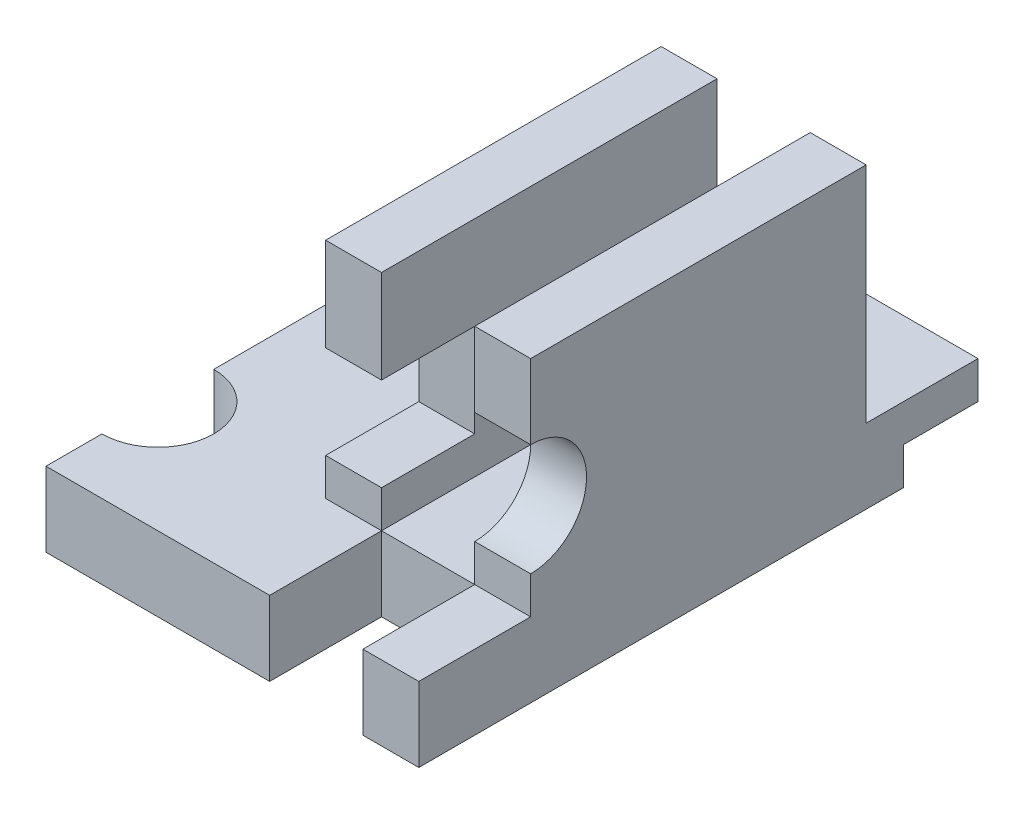
ISO-10303-21;
HEADER;
FILE_DESCRIPTION(('STEP AP214'),'2;1');
FILE_NAME('part.step','',(''),(''),'','','');
FILE_SCHEMA(('AUTOMOTIVE_DESIGN { 1 0 10303 214 1 1 1 1 }'));
ENDSEC;
DATA;
#1=APPLICATION_CONTEXT('core data for automotive mechanical design processes');
#2=APPLICATION_PROTOCOL_DEFINITION('international standard','automotive_design',2000,#1);
#3=PRODUCT_CONTEXT('',#1,'mechanical');
#4=PRODUCT('Part','Part','',(#3));
#5=PRODUCT_RELATED_PRODUCT_CATEGORY('part','',(#4));
#6=PRODUCT_DEFINITION_FORMATION('','',#4);
#7=PRODUCT_DEFINITION_CONTEXT('part definition',#1,'design');
#8=PRODUCT_DEFINITION('design','',#6,#7);
#9=PRODUCT_DEFINITION_SHAPE('','',#8);
#10=(LENGTH_UNIT() NAMED_UNIT(*) SI_UNIT(.MILLI.,.METRE.));
#11=(NAMED_UNIT(*) PLANE_ANGLE_UNIT() SI_UNIT($,.RADIAN.));
#12=(NAMED_UNIT(*) SI_UNIT($,.STERADIAN.) SOLID_ANGLE_UNIT());
#13=UNCERTAINTY_MEASURE_WITH_UNIT(LENGTH_MEASURE(1.E-05),#10,'distance_accuracy_value','');
#14=(GEOMETRIC_REPRESENTATION_CONTEXT(3) GLOBAL_UNCERTAINTY_ASSIGNED_CONTEXT((#13)) GLOBAL_UNIT_ASSIGNED_CONTEXT((#10,
#11,#12)) REPRESENTATION_CONTEXT('',''));
#15=CARTESIAN_POINT('',(0.,0.,0.));
#16=DIRECTION('',(0.,0.,1.));
#17=DIRECTION('',(1.,0.,0.));
#18=AXIS2_PLACEMENT_3D('',#15,#16,#17);
#19=CARTESIAN_POINT('',(10.,60.,45.));
#20=DIRECTION('',(0.,0.,-1.));
#21=DIRECTION('',(-1.,0.,0.));
#22=AXIS2_PLACEMENT_3D('',#19,#20,#21);
#23=PLANE('',#22);
#24=DIRECTION('',(-1.,0.,0.));
#25=VECTOR('',#24,1.);
#26=CARTESIAN_POINT('',(50.001,10.,45.));
#27=LINE('',#26,#25);
#28=CARTESIAN_POINT('',(10.,10.,45.));
#29=VERTEX_POINT('',#28);
#30=CARTESIAN_POINT('',(-4.99999999999998,10.,45.));
#31=VERTEX_POINT('',#30);
#32=EDGE_CURVE('E238',#29,#31,#27,.T.);
#33=ORIENTED_EDGE('',*,*,#32,.T.);
#34=DIRECTION('',(0.,-1.,0.));
#35=VECTOR('',#34,1.);
#36=CARTESIAN_POINT('',(-4.99999999999998,60.,45.));
#37=LINE('',#36,#35);
#38=CARTESIAN_POINT('',(-4.99999999999998,0.,45.));
#39=VERTEX_POINT('',#38);
#40=EDGE_CURVE('E308',#31,#39,#37,.T.);
#41=ORIENTED_EDGE('',*,*,#40,.T.);
#42=DIRECTION('',(1.,0.,0.));
#43=VECTOR('',#42,1.);
#44=CARTESIAN_POINT('',(10.,0.,45.));
#45=LINE('',#44,#43);
#46=CARTESIAN_POINT('',(10.,0.,45.));
#47=VERTEX_POINT('',#46);
#48=EDGE_CURVE('E297',#39,#47,#45,.T.);
#49=ORIENTED_EDGE('',*,*,#48,.T.);
#50=DIRECTION('',(0.,-1.,0.));
#51=VECTOR('',#50,1.);
#52=CARTESIAN_POINT('',(10.,60.,45.));
#53=LINE('',#52,#51);
#54=EDGE_CURVE('E328',#29,#47,#53,.T.);
#55=ORIENTED_EDGE('',*,*,#54,.F.);
#56=EDGE_LOOP('',(#33,#41,#49,#55));
#57=FACE_BOUND('',#56,.T.);
#58=ADVANCED_FACE('F35',(#57),#23,.F.);
#59=DIRECTION('',(-1.,0.,0.));
#60=VECTOR('',#59,1.);
#61=CARTESIAN_POINT('',(50.001,35.,45.));
#62=LINE('',#61,#60);
#63=CARTESIAN_POINT('',(10.,35.,45.));
#64=VERTEX_POINT('',#63);
#65=CARTESIAN_POINT('',(-4.99999999999998,35.,45.));
#66=VERTEX_POINT('',#65);
#67=EDGE_CURVE('E60',#64,#66,#62,.T.);
#68=ORIENTED_EDGE('',*,*,#67,.F.);
#69=CARTESIAN_POINT('',(10.,60.,45.));
#70=VERTEX_POINT('',#69);
#71=EDGE_CURVE('E329',#70,#64,#53,.T.);
#72=ORIENTED_EDGE('',*,*,#71,.F.);
#73=DIRECTION('',(1.,0.,0.));
#74=VECTOR('',#73,1.);
#75=CARTESIAN_POINT('',(10.,60.,45.));
#76=LINE('',#75,#74);
#77=CARTESIAN_POINT('',(-4.99999999999998,60.,45.));
#78=VERTEX_POINT('',#77);
#79=EDGE_CURVE('E298',#78,#70,#76,.T.);
#80=ORIENTED_EDGE('',*,*,#79,.F.);
#81=EDGE_CURVE('E319',#78,#66,#37,.T.);
#82=ORIENTED_EDGE('',*,*,#81,.T.);
#83=EDGE_LOOP('',(#68,#72,#80,#82));
#84=FACE_BOUND('',#83,.T.);
#85=ADVANCED_FACE('F416',(#84),#23,.F.);
#86=CARTESIAN_POINT('',(10.,60.,45.));
#87=DIRECTION('',(-1.,0.,0.));
#88=DIRECTION('',(0.,0.,1.));
#89=AXIS2_PLACEMENT_3D('',#86,#87,#88);
#90=PLANE('',#89);
#91=DIRECTION('',(0.,0.,1.));
#92=VECTOR('',#91,1.);
#93=CARTESIAN_POINT('',(10.,10.,45.));
#94=LINE('',#93,#92);
#95=CARTESIAN_POINT('',(10.,10.,20.));
#96=VERTEX_POINT('',#95);
#97=EDGE_CURVE('E237',#96,#29,#94,.T.);
#98=ORIENTED_EDGE('',*,*,#97,.T.);
#99=ORIENTED_EDGE('',*,*,#54,.T.);
#100=DIRECTION('',(0.,0.,-1.));
#101=VECTOR('',#100,1.);
#102=CARTESIAN_POINT('',(10.,0.,45.));
#103=LINE('',#102,#101);
#104=CARTESIAN_POINT('',(10.,0.,-45.));
#105=VERTEX_POINT('',#104);
#106=EDGE_CURVE('E311',#47,#105,#103,.T.);
#107=ORIENTED_EDGE('',*,*,#106,.T.);
#108=DIRECTION('',(0.,-1.,0.));
#109=VECTOR('',#108,1.);
#110=CARTESIAN_POINT('',(10.,60.,-45.));
#111=LINE('',#110,#109);
#112=CARTESIAN_POINT('',(10.,60.,-45.));
#113=VERTEX_POINT('',#112);
#114=EDGE_CURVE('E325',#113,#105,#111,.T.);
#115=ORIENTED_EDGE('',*,*,#114,.F.);
#116=DIRECTION('',(0.,0.,-1.));
#117=VECTOR('',#116,1.);
#118=CARTESIAN_POINT('',(10.,60.,45.));
#119=LINE('',#118,#117);
#120=EDGE_CURVE('E301',#70,#113,#119,.T.);
#121=ORIENTED_EDGE('',*,*,#120,.F.);
#122=ORIENTED_EDGE('',*,*,#71,.T.);
#123=DIRECTION('',(0.,0.,-1.));
#124=VECTOR('',#123,1.);
#125=CARTESIAN_POINT('',(10.,35.,20.));
#126=LINE('',#125,#124);
#127=CARTESIAN_POINT('',(10.,35.,20.));
#128=VERTEX_POINT('',#127);
#129=EDGE_CURVE('E231',#64,#128,#126,.T.);
#130=ORIENTED_EDGE('',*,*,#129,.T.);
#131=DIRECTION('',(0.,-1.,0.));
#132=VECTOR('',#131,1.);
#133=CARTESIAN_POINT('',(10.,10.,20.));
#134=LINE('',#133,#132);
#135=EDGE_CURVE('E244',#128,#96,#134,.T.);
#136=ORIENTED_EDGE('',*,*,#135,.T.);
#137=EDGE_LOOP('',(#98,#99,#107,#115,#121,#122,#130,#136));
#138=FACE_BOUND('',#137,.T.);
#139=ADVANCED_FACE('F422',(#138),#90,.F.);
#140=CARTESIAN_POINT('',(-4.99999999999998,60.,45.));
#141=DIRECTION('',(1.,0.,0.));
#142=DIRECTION('',(0.,0.,-1.));
#143=AXIS2_PLACEMENT_3D('',#140,#141,#142);
#144=PLANE('',#143);
#145=DIRECTION('',(0.,0.,-1.));
#146=VECTOR('',#145,1.);
#147=CARTESIAN_POINT('',(-4.99999999999998,10.,45.));
#148=LINE('',#147,#146);
#149=CARTESIAN_POINT('',(-4.99999999999998,10.,20.));
#150=VERTEX_POINT('',#149);
#151=EDGE_CURVE('E241',#31,#150,#148,.T.);
#152=ORIENTED_EDGE('',*,*,#151,.T.);
#153=DIRECTION('',(0.,1.,0.));
#154=VECTOR('',#153,1.);
#155=CARTESIAN_POINT('',(-4.99999999999998,10.,20.));
#156=LINE('',#155,#154);
#157=CARTESIAN_POINT('',(-4.99999999999998,35.,20.));
#158=VERTEX_POINT('',#157);
#159=EDGE_CURVE('E235',#150,#158,#156,.T.);
#160=ORIENTED_EDGE('',*,*,#159,.T.);
#161=DIRECTION('',(0.,0.,1.));
#162=VECTOR('',#161,1.);
#163=CARTESIAN_POINT('',(-4.99999999999998,35.,20.));
#164=LINE('',#163,#162);
#165=EDGE_CURVE('E248',#158,#66,#164,.T.);
#166=ORIENTED_EDGE('',*,*,#165,.T.);
#167=ORIENTED_EDGE('',*,*,#81,.F.);
#168=DIRECTION('',(0.,0.,1.));
#169=VECTOR('',#168,1.);
#170=CARTESIAN_POINT('',(-4.99999999999998,60.,45.));
#171=LINE('',#170,#169);
#172=CARTESIAN_POINT('',(-4.99999999999998,60.,-45.));
#173=VERTEX_POINT('',#172);
#174=EDGE_CURVE('E306',#173,#78,#171,.T.);
#175=ORIENTED_EDGE('',*,*,#174,.F.);
#176=DIRECTION('',(0.,-1.,0.));
#177=VECTOR('',#176,1.);
#178=CARTESIAN_POINT('',(-4.99999999999998,60.,-45.));
#179=LINE('',#178,#177);
#180=CARTESIAN_POINT('',(-4.99999999999998,0.,-45.));
#181=VERTEX_POINT('',#180);
#182=EDGE_CURVE('E322',#173,#181,#179,.T.);
#183=ORIENTED_EDGE('',*,*,#182,.T.);
#184=DIRECTION('',(0.,0.,1.));
#185=VECTOR('',#184,1.);
#186=CARTESIAN_POINT('',(-4.99999999999998,0.,45.));
#187=LINE('',#186,#185);
#188=EDGE_CURVE('E302',#181,#39,#187,.T.);
#189=ORIENTED_EDGE('',*,*,#188,.T.);
#190=ORIENTED_EDGE('',*,*,#40,.F.);
#191=EDGE_LOOP('',(#152,#160,#166,#167,#175,#183,#189,#190));
#192=FACE_BOUND('',#191,.T.);
#193=ADVANCED_FACE('F501',(#192),#144,.F.);
#194=CARTESIAN_POINT('',(35.,60.,45.));
#195=DIRECTION('',(0.,0.,-1.));
#196=DIRECTION('',(-1.,0.,0.));
#197=AXIS2_PLACEMENT_3D('',#194,#195,#196);
#198=PLANE('',#197);
#199=DIRECTION('',(0.,-1.,0.));
#200=VECTOR('',#199,1.);
#201=CARTESIAN_POINT('',(35.,60.,45.));
#202=LINE('',#201,#200);
#203=CARTESIAN_POINT('',(35.,60.,45.));
#204=VERTEX_POINT('',#203);
#205=CARTESIAN_POINT('',(35.,40.,45.));
#206=VERTEX_POINT('',#205);
#207=EDGE_CURVE('E291',#204,#206,#202,.T.);
#208=ORIENTED_EDGE('',*,*,#207,.T.);
#209=DIRECTION('',(1.,0.,0.));
#210=VECTOR('',#209,1.);
#211=CARTESIAN_POINT('',(-50.001,40.,45.));
#212=LINE('',#211,#210);
#213=CARTESIAN_POINT('',(50.,40.,45.));
#214=VERTEX_POINT('',#213);
#215=EDGE_CURVE('E262',#206,#214,#212,.T.);
#216=ORIENTED_EDGE('',*,*,#215,.T.);
#217=DIRECTION('',(0.,-1.,0.));
#218=VECTOR('',#217,1.);
#219=CARTESIAN_POINT('',(50.,60.,45.));
#220=LINE('',#219,#218);
#221=CARTESIAN_POINT('',(50.,60.,45.));
#222=VERTEX_POINT('',#221);
#223=EDGE_CURVE('E287',#222,#214,#220,.T.);
#224=ORIENTED_EDGE('',*,*,#223,.F.);
#225=DIRECTION('',(1.,0.,0.));
#226=VECTOR('',#225,1.);
#227=CARTESIAN_POINT('',(35.,60.,45.));
#228=LINE('',#227,#226);
#229=EDGE_CURVE('E272',#204,#222,#228,.T.);
#230=ORIENTED_EDGE('',*,*,#229,.F.);
#231=EDGE_LOOP('',(#208,#216,#224,#230));
#232=FACE_BOUND('',#231,.T.);
#233=ADVANCED_FACE('F447',(#232),#198,.F.);
#234=CARTESIAN_POINT('',(0.,0.,0.));
#235=DIRECTION('',(0.,-1.,0.));
#236=DIRECTION('',(0.,0.,-1.));
#237=AXIS2_PLACEMENT_3D('',#234,#235,#236);
#238=PLANE('',#237);
#239=DIRECTION('',(-1.,0.,0.));
#240=VECTOR('',#239,1.);
#241=CARTESIAN_POINT('',(50.,0.,-45.));
#242=LINE('',#241,#240);
#243=CARTESIAN_POINT('',(50.,0.,-45.));
#244=VERTEX_POINT('',#243);
#245=CARTESIAN_POINT('',(35.,0.,-45.));
#246=VERTEX_POINT('',#245);
#247=EDGE_CURVE('E265',#244,#246,#242,.T.);
#248=ORIENTED_EDGE('',*,*,#247,.F.);
#249=DIRECTION('',(0.,0.,-1.));
#250=VECTOR('',#249,1.);
#251=CARTESIAN_POINT('',(50.,0.,75.));
#252=LINE('',#251,#250);
#253=CARTESIAN_POINT('',(50.,0.,-75.));
#254=VERTEX_POINT('',#253);
#255=EDGE_CURVE('E368',#244,#254,#252,.T.);
#256=ORIENTED_EDGE('',*,*,#255,.T.);
#257=DIRECTION('',(-1.,0.,0.));
#258=VECTOR('',#257,1.);
#259=CARTESIAN_POINT('',(-50.,0.,-75.));
#260=LINE('',#259,#258);
#261=CARTESIAN_POINT('',(-50.,0.,-75.));
#262=VERTEX_POINT('',#261);
#263=EDGE_CURVE('E383',#254,#262,#260,.T.);
#264=ORIENTED_EDGE('',*,*,#263,.T.);
#265=DIRECTION('',(0.,0.,1.));
#266=VECTOR('',#265,1.);
#267=CARTESIAN_POINT('',(-50.,0.,75.));
#268=LINE('',#267,#266);
#269=CARTESIAN_POINT('',(-50.,0.,30.));
#270=VERTEX_POINT('',#269);
#271=EDGE_CURVE('E387',#262,#270,#268,.T.);
#272=ORIENTED_EDGE('',*,*,#271,.T.);
#273=CARTESIAN_POINT('',(-50.,0.,45.));
#274=DIRECTION('',(0.,1.,0.));
#275=DIRECTION('',(0.,0.,1.));
#276=AXIS2_PLACEMENT_3D('',#273,#274,#275);
#277=CIRCLE('',#276,15.);
#278=CARTESIAN_POINT('',(-50.,0.,60.));
#279=VERTEX_POINT('',#278);
#280=EDGE_CURVE('E358',#279,#270,#277,.T.);
#281=ORIENTED_EDGE('',*,*,#280,.F.);
#282=CARTESIAN_POINT('',(-50.,0.,75.));
#283=VERTEX_POINT('',#282);
#284=EDGE_CURVE('E386',#279,#283,#268,.T.);
#285=ORIENTED_EDGE('',*,*,#284,.T.);
#286=DIRECTION('',(1.,0.,0.));
#287=VECTOR('',#286,1.);
#288=CARTESIAN_POINT('',(-50.,0.,75.));
#289=LINE('',#288,#287);
#290=CARTESIAN_POINT('',(10.,0.,75.));
#291=VERTEX_POINT('',#290);
#292=EDGE_CURVE('E373',#283,#291,#289,.T.);
#293=ORIENTED_EDGE('',*,*,#292,.T.);
#294=DIRECTION('',(0.,0.,-1.));
#295=VECTOR('',#294,1.);
#296=CARTESIAN_POINT('',(10.,0.,75.));
#297=LINE('',#296,#295);
#298=EDGE_CURVE('E336',#291,#47,#297,.T.);
#299=ORIENTED_EDGE('',*,*,#298,.T.);
#300=ORIENTED_EDGE('',*,*,#48,.F.);
#301=ORIENTED_EDGE('',*,*,#188,.F.);
#302=DIRECTION('',(-1.,0.,0.));
#303=VECTOR('',#302,1.);
#304=CARTESIAN_POINT('',(-4.99999999999998,0.,-45.));
#305=LINE('',#304,#303);
#306=EDGE_CURVE('E314',#105,#181,#305,.T.);
#307=ORIENTED_EDGE('',*,*,#306,.F.);
#308=ORIENTED_EDGE('',*,*,#106,.F.);
#309=DIRECTION('',(1.,0.,0.));
#310=VECTOR('',#309,1.);
#311=CARTESIAN_POINT('',(10.,0.,45.));
#312=LINE('',#311,#310);
#313=CARTESIAN_POINT('',(35.,0.,45.));
#314=VERTEX_POINT('',#313);
#315=EDGE_CURVE('E332',#47,#314,#312,.T.);
#316=ORIENTED_EDGE('',*,*,#315,.T.);
#317=DIRECTION('',(0.,0.,1.));
#318=VECTOR('',#317,1.);
#319=CARTESIAN_POINT('',(35.,0.,-45.));
#320=LINE('',#319,#318);
#321=EDGE_CURVE('E279',#246,#314,#320,.T.);
#322=ORIENTED_EDGE('',*,*,#321,.F.);
#323=EDGE_LOOP('',(#248,#256,#264,#272,#281,#285,#293,#299,#300,#301,#307,#308,#316,#322));
#324=FACE_BOUND('',#323,.T.);
#325=ADVANCED_FACE('F402',(#324),#238,.F.);
#326=DIRECTION('',(1.,0.,0.));
#327=VECTOR('',#326,1.);
#328=CARTESIAN_POINT('',(35.,0.,45.));
#329=LINE('',#328,#327);
#330=CARTESIAN_POINT('',(50.,0.,45.));
#331=VERTEX_POINT('',#330);
#332=EDGE_CURVE('E270',#314,#331,#329,.T.);
#333=ORIENTED_EDGE('',*,*,#332,.F.);
#334=DIRECTION('',(0.,0.,1.));
#335=VECTOR('',#334,1.);
#336=CARTESIAN_POINT('',(35.,0.,45.));
#337=LINE('',#336,#335);
#338=CARTESIAN_POINT('',(35.,0.,75.));
#339=VERTEX_POINT('',#338);
#340=EDGE_CURVE('E343',#314,#339,#337,.T.);
#341=ORIENTED_EDGE('',*,*,#340,.T.);
#342=CARTESIAN_POINT('',(50.,0.,75.));
#343=VERTEX_POINT('',#342);
#344=EDGE_CURVE('E390',#339,#343,#289,.T.);
#345=ORIENTED_EDGE('',*,*,#344,.T.);
#346=EDGE_CURVE('E380',#343,#331,#252,.T.);
#347=ORIENTED_EDGE('',*,*,#346,.T.);
#348=EDGE_LOOP('',(#333,#341,#345,#347));
#349=FACE_BOUND('',#348,.T.);
#350=ADVANCED_FACE('F446',(#349),#238,.F.);
#351=CARTESIAN_POINT('',(-50.,-20.,75.));
#352=DIRECTION('',(0.,0.,1.));
#353=DIRECTION('',(1.,0.,0.));
#354=AXIS2_PLACEMENT_3D('',#351,#352,#353);
#355=PLANE('',#354);
#356=ORIENTED_EDGE('',*,*,#344,.F.);
#357=DIRECTION('',(0.,1.,0.));
#358=VECTOR('',#357,1.);
#359=CARTESIAN_POINT('',(35.,-20.,75.));
#360=LINE('',#359,#358);
#361=CARTESIAN_POINT('',(35.,-20.,75.));
#362=VERTEX_POINT('',#361);
#363=EDGE_CURVE('E353',#362,#339,#360,.T.);
#364=ORIENTED_EDGE('',*,*,#363,.F.);
#365=DIRECTION('',(1.,0.,0.));
#366=VECTOR('',#365,1.);
#367=CARTESIAN_POINT('',(-50.,-20.,75.));
#368=LINE('',#367,#366);
#369=CARTESIAN_POINT('',(50.,-20.,75.));
#370=VERTEX_POINT('',#369);
#371=EDGE_CURVE('E376',#362,#370,#368,.T.);
#372=ORIENTED_EDGE('',*,*,#371,.T.);
#373=DIRECTION('',(0.,1.,0.));
#374=VECTOR('',#373,1.);
#375=CARTESIAN_POINT('',(50.,-20.,75.));
#376=LINE('',#375,#374);
#377=EDGE_CURVE('E11',#370,#343,#376,.T.);
#378=ORIENTED_EDGE('',*,*,#377,.T.);
#379=EDGE_LOOP('',(#356,#364,#372,#378));
#380=FACE_BOUND('',#379,.T.);
#381=ADVANCED_FACE('F448',(#380),#355,.T.);
#382=CARTESIAN_POINT('',(-50.,-20.,75.));
#383=VERTEX_POINT('',#382);
#384=CARTESIAN_POINT('',(10.,-20.,75.));
#385=VERTEX_POINT('',#384);
#386=EDGE_CURVE('E377',#383,#385,#368,.T.);
#387=ORIENTED_EDGE('',*,*,#386,.T.);
#388=DIRECTION('',(0.,1.,0.));
#389=VECTOR('',#388,1.);
#390=CARTESIAN_POINT('',(10.,-20.,75.));
#391=LINE('',#390,#389);
#392=EDGE_CURVE('E350',#385,#291,#391,.T.);
#393=ORIENTED_EDGE('',*,*,#392,.T.);
#394=ORIENTED_EDGE('',*,*,#292,.F.);
#395=DIRECTION('',(0.,1.,0.));
#396=VECTOR('',#395,1.);
#397=CARTESIAN_POINT('',(-50.,-20.,75.));
#398=LINE('',#397,#396);
#399=EDGE_CURVE('E44',#383,#283,#398,.T.);
#400=ORIENTED_EDGE('',*,*,#399,.F.);
#401=EDGE_LOOP('',(#387,#393,#394,#400));
#402=FACE_BOUND('',#401,.T.);
#403=ADVANCED_FACE('F442',(#402),#355,.T.);
#404=CARTESIAN_POINT('',(0.,-20.,0.));
#405=DIRECTION('',(0.,-1.,0.));
#406=DIRECTION('',(0.,0.,-1.));
#407=AXIS2_PLACEMENT_3D('',#404,#405,#406);
#408=PLANE('',#407);
#409=DIRECTION('',(1.,0.,0.));
#410=VECTOR('',#409,1.);
#411=CARTESIAN_POINT('',(-50.,-20.,-55.));
#412=LINE('',#411,#410);
#413=CARTESIAN_POINT('',(-50.,-20.,-55.));
#414=VERTEX_POINT('',#413);
#415=CARTESIAN_POINT('',(50.,-20.,-55.));
#416=VERTEX_POINT('',#415);
#417=EDGE_CURVE('E210',#414,#416,#412,.T.);
#418=ORIENTED_EDGE('',*,*,#417,.T.);
#419=DIRECTION('',(0.,0.,-1.));
#420=VECTOR('',#419,1.);
#421=CARTESIAN_POINT('',(50.,-20.,75.));
#422=LINE('',#421,#420);
#423=EDGE_CURVE('E369',#370,#416,#422,.T.);
#424=ORIENTED_EDGE('',*,*,#423,.F.);
#425=ORIENTED_EDGE('',*,*,#371,.F.);
#426=DIRECTION('',(0.,0.,1.));
#427=VECTOR('',#426,1.);
#428=CARTESIAN_POINT('',(35.,-20.,45.));
#429=LINE('',#428,#427);
#430=CARTESIAN_POINT('',(35.,-20.,45.));
#431=VERTEX_POINT('',#430);
#432=EDGE_CURVE('E335',#431,#362,#429,.T.);
#433=ORIENTED_EDGE('',*,*,#432,.F.);
#434=DIRECTION('',(1.,0.,0.));
#435=VECTOR('',#434,1.);
#436=CARTESIAN_POINT('',(10.,-20.,45.));
#437=LINE('',#436,#435);
#438=CARTESIAN_POINT('',(10.,-20.,45.));
#439=VERTEX_POINT('',#438);
#440=EDGE_CURVE('E333',#439,#431,#437,.T.);
#441=ORIENTED_EDGE('',*,*,#440,.F.);
#442=DIRECTION('',(0.,0.,-1.));
#443=VECTOR('',#442,1.);
#444=CARTESIAN_POINT('',(10.,-20.,75.));
#445=LINE('',#444,#443);
#446=EDGE_CURVE('E338',#385,#439,#445,.T.);
#447=ORIENTED_EDGE('',*,*,#446,.F.);
#448=ORIENTED_EDGE('',*,*,#386,.F.);
#449=DIRECTION('',(0.,0.,1.));
#450=VECTOR('',#449,1.);
#451=CARTESIAN_POINT('',(-50.,-20.,75.));
#452=LINE('',#451,#450);
#453=CARTESIAN_POINT('',(-50.,-20.,60.));
#454=VERTEX_POINT('',#453);
#455=EDGE_CURVE('E372',#454,#383,#452,.T.);
#456=ORIENTED_EDGE('',*,*,#455,.F.);
#457=CARTESIAN_POINT('',(-50.,-20.,45.));
#458=DIRECTION('',(0.,1.,0.));
#459=DIRECTION('',(0.,0.,1.));
#460=AXIS2_PLACEMENT_3D('',#457,#458,#459);
#461=CIRCLE('',#460,15.);
#462=CARTESIAN_POINT('',(-50.,-20.,30.));
#463=VERTEX_POINT('',#462);
#464=EDGE_CURVE('E359',#454,#463,#461,.T.);
#465=ORIENTED_EDGE('',*,*,#464,.T.);
#466=EDGE_CURVE('E374',#414,#463,#452,.T.);
#467=ORIENTED_EDGE('',*,*,#466,.F.);
#468=EDGE_LOOP('',(#418,#424,#425,#433,#441,#447,#448,#456,#465,#467));
#469=FACE_BOUND('',#468,.T.);
#470=ADVANCED_FACE('F439',(#469),#408,.T.);
#471=CARTESIAN_POINT('',(-50.,-20.,75.));
#472=DIRECTION('',(-1.,0.,0.));
#473=DIRECTION('',(0.,0.,1.));
#474=AXIS2_PLACEMENT_3D('',#471,#472,#473);
#475=PLANE('',#474);
#476=DIRECTION('',(0.,1.,0.));
#477=VECTOR('',#476,1.);
#478=CARTESIAN_POINT('',(-50.,-20.,60.));
#479=LINE('',#478,#477);
#480=EDGE_CURVE('E366',#454,#279,#479,.T.);
#481=ORIENTED_EDGE('',*,*,#480,.F.);
#482=ORIENTED_EDGE('',*,*,#455,.T.);
#483=ORIENTED_EDGE('',*,*,#399,.T.);
#484=ORIENTED_EDGE('',*,*,#284,.F.);
#485=EDGE_LOOP('',(#481,#482,#483,#484));
#486=FACE_BOUND('',#485,.T.);
#487=ADVANCED_FACE('F414',(#486),#475,.T.);
#488=CARTESIAN_POINT('',(50.,-20.,75.));
#489=DIRECTION('',(1.,0.,0.));
#490=DIRECTION('',(0.,0.,-1.));
#491=AXIS2_PLACEMENT_3D('',#488,#489,#490);
#492=PLANE('',#491);
#493=DIRECTION('',(0.,-1.,0.));
#494=VECTOR('',#493,1.);
#495=CARTESIAN_POINT('',(50.,-10.,-55.));
#496=LINE('',#495,#494);
#497=CARTESIAN_POINT('',(50.,-10.,-55.));
#498=VERTEX_POINT('',#497);
#499=EDGE_CURVE('E224',#498,#416,#496,.T.);
#500=ORIENTED_EDGE('',*,*,#499,.F.);
#501=DIRECTION('',(0.,0.,1.));
#502=VECTOR('',#501,1.);
#503=CARTESIAN_POINT('',(50.,-10.,-75.));
#504=LINE('',#503,#502);
#505=CARTESIAN_POINT('',(50.,-10.,-75.));
#506=VERTEX_POINT('',#505);
#507=EDGE_CURVE('E207',#506,#498,#504,.T.);
#508=ORIENTED_EDGE('',*,*,#507,.F.);
#509=DIRECTION('',(0.,1.,0.));
#510=VECTOR('',#509,1.);
#511=CARTESIAN_POINT('',(50.,-20.,-75.));
#512=LINE('',#511,#510);
#513=EDGE_CURVE('E39',#506,#254,#512,.T.);
#514=ORIENTED_EDGE('',*,*,#513,.T.);
#515=ORIENTED_EDGE('',*,*,#255,.F.);
#516=DIRECTION('',(0.,-1.,0.));
#517=VECTOR('',#516,1.);
#518=CARTESIAN_POINT('',(50.,60.,-45.));
#519=LINE('',#518,#517);
#520=CARTESIAN_POINT('',(50.,60.,-45.));
#521=VERTEX_POINT('',#520);
#522=EDGE_CURVE('E276',#521,#244,#519,.T.);
#523=ORIENTED_EDGE('',*,*,#522,.F.);
#524=DIRECTION('',(0.,0.,-1.));
#525=VECTOR('',#524,1.);
#526=CARTESIAN_POINT('',(50.,60.,45.));
#527=LINE('',#526,#525);
#528=EDGE_CURVE('E274',#222,#521,#527,.T.);
#529=ORIENTED_EDGE('',*,*,#528,.F.);
#530=ORIENTED_EDGE('',*,*,#223,.T.);
#531=CARTESIAN_POINT('',(50.,25.,45.));
#532=DIRECTION('',(1.,0.,0.));
#533=DIRECTION('',(0.,0.,-1.));
#534=AXIS2_PLACEMENT_3D('',#531,#532,#533);
#535=CIRCLE('',#534,15.);
#536=CARTESIAN_POINT('',(50.,10.,45.));
#537=VERTEX_POINT('',#536);
#538=EDGE_CURVE('E257',#537,#214,#535,.T.);
#539=ORIENTED_EDGE('',*,*,#538,.F.);
#540=EDGE_CURVE('E286',#537,#331,#220,.T.);
#541=ORIENTED_EDGE('',*,*,#540,.T.);
#542=ORIENTED_EDGE('',*,*,#346,.F.);
#543=ORIENTED_EDGE('',*,*,#377,.F.);
#544=ORIENTED_EDGE('',*,*,#423,.T.);
#545=EDGE_LOOP('',(#500,#508,#514,#515,#523,#529,#530,#539,#541,#542,#543,#544));
#546=FACE_BOUND('',#545,.T.);
#547=ADVANCED_FACE('F37',(#546),#492,.T.);
#548=DIRECTION('',(0.,-1.,0.));
#549=VECTOR('',#548,1.);
#550=CARTESIAN_POINT('',(-50.,-10.,-55.));
#551=LINE('',#550,#549);
#552=CARTESIAN_POINT('',(-50.,-10.,-55.));
#553=VERTEX_POINT('',#552);
#554=EDGE_CURVE('E214',#553,#414,#551,.T.);
#555=ORIENTED_EDGE('',*,*,#554,.T.);
#556=ORIENTED_EDGE('',*,*,#466,.T.);
#557=DIRECTION('',(0.,1.,0.));
#558=VECTOR('',#557,1.);
#559=CARTESIAN_POINT('',(-50.,-20.,30.));
#560=LINE('',#559,#558);
#561=EDGE_CURVE('E362',#270,#463,#560,.F.);
#562=ORIENTED_EDGE('',*,*,#561,.F.);
#563=ORIENTED_EDGE('',*,*,#271,.F.);
#564=DIRECTION('',(0.,1.,0.));
#565=VECTOR('',#564,1.);
#566=CARTESIAN_POINT('',(-50.,-20.,-75.));
#567=LINE('',#566,#565);
#568=CARTESIAN_POINT('',(-50.,-10.,-75.));
#569=VERTEX_POINT('',#568);
#570=EDGE_CURVE('E223',#569,#262,#567,.T.);
#571=ORIENTED_EDGE('',*,*,#570,.F.);
#572=DIRECTION('',(0.,0.,1.));
#573=VECTOR('',#572,1.);
#574=CARTESIAN_POINT('',(-50.,-10.,-75.));
#575=LINE('',#574,#573);
#576=EDGE_CURVE('E52',#569,#553,#575,.T.);
#577=ORIENTED_EDGE('',*,*,#576,.T.);
#578=EDGE_LOOP('',(#555,#556,#562,#563,#571,#577));
#579=FACE_BOUND('',#578,.T.);
#580=ADVANCED_FACE('F221',(#579),#475,.T.);
#581=CARTESIAN_POINT('',(-50.,-20.,-75.));
#582=DIRECTION('',(0.,0.,-1.));
#583=DIRECTION('',(-1.,0.,0.));
#584=AXIS2_PLACEMENT_3D('',#581,#582,#583);
#585=PLANE('',#584);
#586=DIRECTION('',(1.,0.,0.));
#587=VECTOR('',#586,1.);
#588=CARTESIAN_POINT('',(-50.,-10.,-75.));
#589=LINE('',#588,#587);
#590=EDGE_CURVE('E211',#569,#506,#589,.T.);
#591=ORIENTED_EDGE('',*,*,#590,.F.);
#592=ORIENTED_EDGE('',*,*,#570,.T.);
#593=ORIENTED_EDGE('',*,*,#263,.F.);
#594=ORIENTED_EDGE('',*,*,#513,.F.);
#595=EDGE_LOOP('',(#591,#592,#593,#594));
#596=FACE_BOUND('',#595,.T.);
#597=ADVANCED_FACE('F403',(#596),#585,.T.);
#598=CARTESIAN_POINT('',(-50.,-20.,45.));
#599=DIRECTION('',(0.,1.,0.));
#600=DIRECTION('',(0.,0.,1.));
#601=AXIS2_PLACEMENT_3D('',#598,#599,#600);
#602=CYLINDRICAL_SURFACE('',#601,15.);
#603=ORIENTED_EDGE('',*,*,#480,.T.);
#604=ORIENTED_EDGE('',*,*,#280,.T.);
#605=ORIENTED_EDGE('',*,*,#561,.T.);
#606=ORIENTED_EDGE('',*,*,#464,.F.);
#607=EDGE_LOOP('',(#603,#604,#605,#606));
#608=FACE_BOUND('',#607,.T.);
#609=ADVANCED_FACE('F405',(#608),#602,.F.);
#610=CARTESIAN_POINT('',(10.,-20.,45.));
#611=DIRECTION('',(0.,0.,1.));
#612=DIRECTION('',(1.,0.,0.));
#613=AXIS2_PLACEMENT_3D('',#610,#611,#612);
#614=PLANE('',#613);
#615=ORIENTED_EDGE('',*,*,#315,.F.);
#616=DIRECTION('',(0.,1.,0.));
#617=VECTOR('',#616,1.);
#618=CARTESIAN_POINT('',(10.,-20.,45.));
#619=LINE('',#618,#617);
#620=EDGE_CURVE('E340',#439,#47,#619,.T.);
#621=ORIENTED_EDGE('',*,*,#620,.F.);
#622=ORIENTED_EDGE('',*,*,#440,.T.);
#623=DIRECTION('',(0.,1.,0.));
#624=VECTOR('',#623,1.);
#625=CARTESIAN_POINT('',(35.,-20.,45.));
#626=LINE('',#625,#624);
#627=EDGE_CURVE('E355',#431,#314,#626,.T.);
#628=ORIENTED_EDGE('',*,*,#627,.T.);
#629=EDGE_LOOP('',(#615,#621,#622,#628));
#630=FACE_BOUND('',#629,.T.);
#631=ADVANCED_FACE('F410',(#630),#614,.T.);
#632=CARTESIAN_POINT('',(35.,-20.,45.));
#633=DIRECTION('',(-1.,0.,0.));
#634=DIRECTION('',(0.,0.,1.));
#635=AXIS2_PLACEMENT_3D('',#632,#633,#634);
#636=PLANE('',#635);
#637=ORIENTED_EDGE('',*,*,#340,.F.);
#638=ORIENTED_EDGE('',*,*,#627,.F.);
#639=ORIENTED_EDGE('',*,*,#432,.T.);
#640=ORIENTED_EDGE('',*,*,#363,.T.);
#641=EDGE_LOOP('',(#637,#638,#639,#640));
#642=FACE_BOUND('',#641,.T.);
#643=ADVANCED_FACE('F431',(#642),#636,.T.);
#644=CARTESIAN_POINT('',(10.,-20.,75.));
#645=DIRECTION('',(1.,0.,0.));
#646=DIRECTION('',(0.,0.,-1.));
#647=AXIS2_PLACEMENT_3D('',#644,#645,#646);
#648=PLANE('',#647);
#649=ORIENTED_EDGE('',*,*,#298,.F.);
#650=ORIENTED_EDGE('',*,*,#392,.F.);
#651=ORIENTED_EDGE('',*,*,#446,.T.);
#652=ORIENTED_EDGE('',*,*,#620,.T.);
#653=EDGE_LOOP('',(#649,#650,#651,#652));
#654=FACE_BOUND('',#653,.T.);
#655=ADVANCED_FACE('F427',(#654),#648,.T.);
#656=CARTESIAN_POINT('',(-4.99999999999998,60.,-45.));
#657=DIRECTION('',(0.,0.,1.));
#658=DIRECTION('',(1.,0.,0.));
#659=AXIS2_PLACEMENT_3D('',#656,#657,#658);
#660=PLANE('',#659);
#661=ORIENTED_EDGE('',*,*,#306,.T.);
#662=ORIENTED_EDGE('',*,*,#182,.F.);
#663=DIRECTION('',(-1.,0.,0.));
#664=VECTOR('',#663,1.);
#665=CARTESIAN_POINT('',(-4.99999999999998,60.,-45.));
#666=LINE('',#665,#664);
#667=EDGE_CURVE('E304',#113,#173,#666,.T.);
#668=ORIENTED_EDGE('',*,*,#667,.F.);
#669=ORIENTED_EDGE('',*,*,#114,.T.);
#670=EDGE_LOOP('',(#661,#662,#668,#669));
#671=FACE_BOUND('',#670,.T.);
#672=ADVANCED_FACE('F430',(#671),#660,.F.);
#673=CARTESIAN_POINT('',(0.,60.,0.));
#674=DIRECTION('',(0.,-1.,0.));
#675=DIRECTION('',(0.,0.,-1.));
#676=AXIS2_PLACEMENT_3D('',#673,#674,#675);
#677=PLANE('',#676);
#678=ORIENTED_EDGE('',*,*,#79,.T.);
#679=ORIENTED_EDGE('',*,*,#120,.T.);
#680=ORIENTED_EDGE('',*,*,#667,.T.);
#681=ORIENTED_EDGE('',*,*,#174,.T.);
#682=EDGE_LOOP('',(#678,#679,#680,#681));
#683=FACE_BOUND('',#682,.T.);
#684=ADVANCED_FACE('F512',(#683),#677,.F.);
#685=CARTESIAN_POINT('',(50.,60.,-45.));
#686=DIRECTION('',(0.,0.,1.));
#687=DIRECTION('',(1.,0.,0.));
#688=AXIS2_PLACEMENT_3D('',#685,#686,#687);
#689=PLANE('',#688);
#690=ORIENTED_EDGE('',*,*,#247,.T.);
#691=DIRECTION('',(0.,-1.,0.));
#692=VECTOR('',#691,1.);
#693=CARTESIAN_POINT('',(35.,60.,-45.));
#694=LINE('',#693,#692);
#695=CARTESIAN_POINT('',(35.,60.,-45.));
#696=VERTEX_POINT('',#695);
#697=EDGE_CURVE('E294',#696,#246,#694,.T.);
#698=ORIENTED_EDGE('',*,*,#697,.F.);
#699=DIRECTION('',(-1.,0.,0.));
#700=VECTOR('',#699,1.);
#701=CARTESIAN_POINT('',(50.,60.,-45.));
#702=LINE('',#701,#700);
#703=EDGE_CURVE('E266',#521,#696,#702,.T.);
#704=ORIENTED_EDGE('',*,*,#703,.F.);
#705=ORIENTED_EDGE('',*,*,#522,.T.);
#706=EDGE_LOOP('',(#690,#698,#704,#705));
#707=FACE_BOUND('',#706,.T.);
#708=ADVANCED_FACE('F478',(#707),#689,.F.);
#709=CARTESIAN_POINT('',(35.,60.,-45.));
#710=DIRECTION('',(1.,0.,0.));
#711=DIRECTION('',(0.,0.,-1.));
#712=AXIS2_PLACEMENT_3D('',#709,#710,#711);
#713=PLANE('',#712);
#714=CARTESIAN_POINT('',(35.,10.,45.));
#715=VERTEX_POINT('',#714);
#716=EDGE_CURVE('E290',#715,#314,#202,.T.);
#717=ORIENTED_EDGE('',*,*,#716,.F.);
#718=CARTESIAN_POINT('',(35.,25.,45.));
#719=DIRECTION('',(1.,0.,0.));
#720=DIRECTION('',(0.,0.,-1.));
#721=AXIS2_PLACEMENT_3D('',#718,#719,#720);
#722=CIRCLE('',#721,15.);
#723=EDGE_CURVE('E250',#206,#715,#722,.F.);
#724=ORIENTED_EDGE('',*,*,#723,.F.);
#725=ORIENTED_EDGE('',*,*,#207,.F.);
#726=DIRECTION('',(0.,0.,1.));
#727=VECTOR('',#726,1.);
#728=CARTESIAN_POINT('',(35.,60.,-45.));
#729=LINE('',#728,#727);
#730=EDGE_CURVE('E269',#696,#204,#729,.T.);
#731=ORIENTED_EDGE('',*,*,#730,.F.);
#732=ORIENTED_EDGE('',*,*,#697,.T.);
#733=ORIENTED_EDGE('',*,*,#321,.T.);
#734=EDGE_LOOP('',(#717,#724,#725,#731,#732,#733));
#735=FACE_BOUND('',#734,.T.);
#736=ADVANCED_FACE('F472',(#735),#713,.F.);
#737=ORIENTED_EDGE('',*,*,#540,.F.);
#738=DIRECTION('',(1.,0.,0.));
#739=VECTOR('',#738,1.);
#740=CARTESIAN_POINT('',(-50.001,10.,45.));
#741=LINE('',#740,#739);
#742=EDGE_CURVE('E259',#715,#537,#741,.T.);
#743=ORIENTED_EDGE('',*,*,#742,.F.);
#744=ORIENTED_EDGE('',*,*,#716,.T.);
#745=ORIENTED_EDGE('',*,*,#332,.T.);
#746=EDGE_LOOP('',(#737,#743,#744,#745));
#747=FACE_BOUND('',#746,.T.);
#748=ADVANCED_FACE('F491',(#747),#198,.F.);
#749=CARTESIAN_POINT('',(0.,60.,0.));
#750=DIRECTION('',(0.,1.,0.));
#751=DIRECTION('',(0.,0.,1.));
#752=AXIS2_PLACEMENT_3D('',#749,#750,#751);
#753=PLANE('',#752);
#754=ORIENTED_EDGE('',*,*,#703,.T.);
#755=ORIENTED_EDGE('',*,*,#730,.T.);
#756=ORIENTED_EDGE('',*,*,#229,.T.);
#757=ORIENTED_EDGE('',*,*,#528,.T.);
#758=EDGE_LOOP('',(#754,#755,#756,#757));
#759=FACE_BOUND('',#758,.T.);
#760=ADVANCED_FACE('F483',(#759),#753,.T.);
#761=CARTESIAN_POINT('',(-50.001,25.,45.));
#762=DIRECTION('',(1.,0.,0.));
#763=DIRECTION('',(0.,0.,-1.));
#764=AXIS2_PLACEMENT_3D('',#761,#762,#763);
#765=CYLINDRICAL_SURFACE('',#764,15.);
#766=ORIENTED_EDGE('',*,*,#723,.T.);
#767=ORIENTED_EDGE('',*,*,#742,.T.);
#768=ORIENTED_EDGE('',*,*,#538,.T.);
#769=ORIENTED_EDGE('',*,*,#215,.F.);
#770=EDGE_LOOP('',(#766,#767,#768,#769));
#771=FACE_BOUND('',#770,.T.);
#772=ADVANCED_FACE('F487',(#771),#765,.F.);
#773=CARTESIAN_POINT('',(50.001,10.,45.));
#774=DIRECTION('',(0.,1.,0.));
#775=DIRECTION('',(0.,0.,1.));
#776=AXIS2_PLACEMENT_3D('',#773,#774,#775);
#777=PLANE('',#776);
#778=DIRECTION('',(-1.,0.,0.));
#779=VECTOR('',#778,1.);
#780=CARTESIAN_POINT('',(50.001,10.,20.));
#781=LINE('',#780,#779);
#782=EDGE_CURVE('E247',#96,#150,#781,.T.);
#783=ORIENTED_EDGE('',*,*,#782,.T.);
#784=ORIENTED_EDGE('',*,*,#151,.F.);
#785=ORIENTED_EDGE('',*,*,#32,.F.);
#786=ORIENTED_EDGE('',*,*,#97,.F.);
#787=EDGE_LOOP('',(#783,#784,#785,#786));
#788=FACE_BOUND('',#787,.T.);
#789=ADVANCED_FACE('F586',(#788),#777,.T.);
#790=CARTESIAN_POINT('',(50.001,10.,20.));
#791=DIRECTION('',(0.,0.,1.));
#792=DIRECTION('',(1.,0.,0.));
#793=AXIS2_PLACEMENT_3D('',#790,#791,#792);
#794=PLANE('',#793);
#795=DIRECTION('',(-1.,0.,0.));
#796=VECTOR('',#795,1.);
#797=CARTESIAN_POINT('',(50.001,35.,20.));
#798=LINE('',#797,#796);
#799=EDGE_CURVE('E234',#128,#158,#798,.T.);
#800=ORIENTED_EDGE('',*,*,#799,.T.);
#801=ORIENTED_EDGE('',*,*,#159,.F.);
#802=ORIENTED_EDGE('',*,*,#782,.F.);
#803=ORIENTED_EDGE('',*,*,#135,.F.);
#804=EDGE_LOOP('',(#800,#801,#802,#803));
#805=FACE_BOUND('',#804,.T.);
#806=ADVANCED_FACE('F583',(#805),#794,.T.);
#807=CARTESIAN_POINT('',(50.001,35.,20.));
#808=DIRECTION('',(0.,-1.,0.));
#809=DIRECTION('',(0.,0.,-1.));
#810=AXIS2_PLACEMENT_3D('',#807,#808,#809);
#811=PLANE('',#810);
#812=ORIENTED_EDGE('',*,*,#67,.T.);
#813=ORIENTED_EDGE('',*,*,#165,.F.);
#814=ORIENTED_EDGE('',*,*,#799,.F.);
#815=ORIENTED_EDGE('',*,*,#129,.F.);
#816=EDGE_LOOP('',(#812,#813,#814,#815));
#817=FACE_BOUND('',#816,.T.);
#818=ADVANCED_FACE('F567',(#817),#811,.T.);
#819=CARTESIAN_POINT('',(-50.,-10.,-55.));
#820=DIRECTION('',(0.,0.,1.));
#821=DIRECTION('',(0.,-1.,0.));
#822=AXIS2_PLACEMENT_3D('',#819,#820,#821);
#823=PLANE('',#822);
#824=ORIENTED_EDGE('',*,*,#499,.T.);
#825=ORIENTED_EDGE('',*,*,#417,.F.);
#826=ORIENTED_EDGE('',*,*,#554,.F.);
#827=DIRECTION('',(1.,0.,0.));
#828=VECTOR('',#827,1.);
#829=CARTESIAN_POINT('',(-50.,-10.,-55.));
#830=LINE('',#829,#828);
#831=EDGE_CURVE('E203',#553,#498,#830,.T.);
#832=ORIENTED_EDGE('',*,*,#831,.T.);
#833=EDGE_LOOP('',(#824,#825,#826,#832));
#834=FACE_BOUND('',#833,.T.);
#835=ADVANCED_FACE('F215',(#834),#823,.F.);
#836=CARTESIAN_POINT('',(-50.,-10.,-75.));
#837=DIRECTION('',(0.,1.,0.));
#838=DIRECTION('',(0.,0.,1.));
#839=AXIS2_PLACEMENT_3D('',#836,#837,#838);
#840=PLANE('',#839);
#841=ORIENTED_EDGE('',*,*,#507,.T.);
#842=ORIENTED_EDGE('',*,*,#831,.F.);
#843=ORIENTED_EDGE('',*,*,#576,.F.);
#844=ORIENTED_EDGE('',*,*,#590,.T.);
#845=EDGE_LOOP('',(#841,#842,#843,#844));
#846=FACE_BOUND('',#845,.T.);
#847=ADVANCED_FACE('F205',(#846),#840,.F.);
#848=CLOSED_SHELL('',(#58,#85,#139,#193,#233,#325,#350,#381,#403,#470,#487,#547,#580,#597,#609,
#631,#643,#655,#672,#684,#708,#736,#748,#760,#772,#789,#806,#818,#835,#847));
#849=MANIFOLD_SOLID_BREP('B2',#848);
#850=ADVANCED_BREP_SHAPE_REPRESENTATION('',(#18,#849),#14);
#851=SHAPE_DEFINITION_REPRESENTATION(#9,#850);
ENDSEC;
END-ISO-10303-21;
